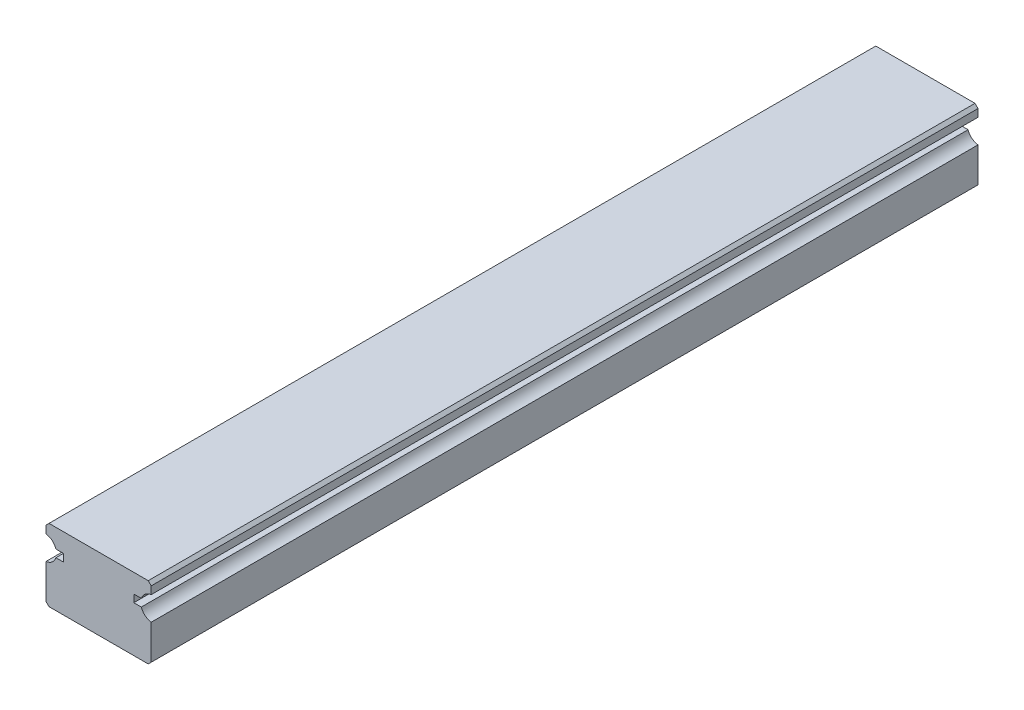
ISO-10303-21;
HEADER;
FILE_DESCRIPTION(('STEP AP214'),'2;1');
FILE_NAME('part.step','',(''),(''),'','','');
FILE_SCHEMA(('AUTOMOTIVE_DESIGN { 1 0 10303 214 1 1 1 1 }'));
ENDSEC;
DATA;
#1=APPLICATION_CONTEXT('core data for automotive mechanical design processes');
#2=APPLICATION_PROTOCOL_DEFINITION('international standard','automotive_design',2000,#1);
#3=PRODUCT_CONTEXT('',#1,'mechanical');
#4=PRODUCT('Part','Part','',(#3));
#5=PRODUCT_RELATED_PRODUCT_CATEGORY('part','',(#4));
#6=PRODUCT_DEFINITION_FORMATION('','',#4);
#7=PRODUCT_DEFINITION_CONTEXT('part definition',#1,'design');
#8=PRODUCT_DEFINITION('design','',#6,#7);
#9=PRODUCT_DEFINITION_SHAPE('','',#8);
#10=(LENGTH_UNIT() NAMED_UNIT(*) SI_UNIT(.MILLI.,.METRE.));
#11=(NAMED_UNIT(*) PLANE_ANGLE_UNIT() SI_UNIT($,.RADIAN.));
#12=(NAMED_UNIT(*) SI_UNIT($,.STERADIAN.) SOLID_ANGLE_UNIT());
#13=UNCERTAINTY_MEASURE_WITH_UNIT(LENGTH_MEASURE(1.E-05),#10,'distance_accuracy_value','');
#14=(GEOMETRIC_REPRESENTATION_CONTEXT(3) GLOBAL_UNCERTAINTY_ASSIGNED_CONTEXT((#13)) GLOBAL_UNIT_ASSIGNED_CONTEXT((#10,
#11,#12)) REPRESENTATION_CONTEXT('',''));
#15=CARTESIAN_POINT('',(0.,0.,0.));
#16=DIRECTION('',(0.,0.,1.));
#17=DIRECTION('',(1.,0.,0.));
#18=AXIS2_PLACEMENT_3D('',#15,#16,#17);
#19=CARTESIAN_POINT('',(-3.6,0.899999999999999,27.5));
#20=DIRECTION('',(0.,0.,-1.));
#21=DIRECTION('',(-1.,0.,0.));
#22=AXIS2_PLACEMENT_3D('',#19,#20,#21);
#23=CYLINDRICAL_SURFACE('',#22,0.800000000000001);
#24=CARTESIAN_POINT('',(-3.6,0.899999999999999,-27.5));
#25=DIRECTION('',(0.,0.,-1.));
#26=DIRECTION('',(-1.,0.,0.));
#27=AXIS2_PLACEMENT_3D('',#24,#25,#26);
#28=CIRCLE('',#27,0.800000000000001);
#29=CARTESIAN_POINT('',(-3.5,1.69372539331938,-27.5));
#30=VERTEX_POINT('',#29);
#31=CARTESIAN_POINT('',(-2.84006579232147,1.15,-27.5));
#32=VERTEX_POINT('',#31);
#33=EDGE_CURVE('E202',#30,#32,#28,.T.);
#34=ORIENTED_EDGE('',*,*,#33,.T.);
#35=DIRECTION('',(0.,0.,-1.));
#36=VECTOR('',#35,1.);
#37=CARTESIAN_POINT('',(-2.84006579232147,1.15,27.5));
#38=LINE('',#37,#36);
#39=CARTESIAN_POINT('',(-2.84006579232147,1.15,27.5));
#40=VERTEX_POINT('',#39);
#41=EDGE_CURVE('E11',#40,#32,#38,.T.);
#42=ORIENTED_EDGE('',*,*,#41,.F.);
#43=CARTESIAN_POINT('',(-3.6,0.899999999999999,27.5));
#44=DIRECTION('',(0.,0.,-1.));
#45=DIRECTION('',(-1.,0.,0.));
#46=AXIS2_PLACEMENT_3D('',#43,#44,#45);
#47=CIRCLE('',#46,0.800000000000001);
#48=CARTESIAN_POINT('',(-3.5,1.69372539331938,27.5));
#49=VERTEX_POINT('',#48);
#50=EDGE_CURVE('E240',#49,#40,#47,.T.);
#51=ORIENTED_EDGE('',*,*,#50,.F.);
#52=DIRECTION('',(0.,0.,-1.));
#53=VECTOR('',#52,1.);
#54=CARTESIAN_POINT('',(-3.5,1.69372539331938,27.5));
#55=LINE('',#54,#53);
#56=EDGE_CURVE('E198',#49,#30,#55,.T.);
#57=ORIENTED_EDGE('',*,*,#56,.T.);
#58=EDGE_LOOP('',(#34,#42,#51,#57));
#59=FACE_BOUND('',#58,.T.);
#60=ADVANCED_FACE('F34',(#59),#23,.F.);
#61=CARTESIAN_POINT('',(-2.84006579232147,1.15,27.5));
#62=DIRECTION('',(0.,1.,0.));
#63=DIRECTION('',(-1.,0.,0.));
#64=AXIS2_PLACEMENT_3D('',#61,#62,#63);
#65=PLANE('',#64);
#66=DIRECTION('',(1.,0.,0.));
#67=VECTOR('',#66,1.);
#68=CARTESIAN_POINT('',(-2.84006579232147,1.15,-27.5));
#69=LINE('',#68,#67);
#70=CARTESIAN_POINT('',(-2.34006579232147,1.15,-27.5));
#71=VERTEX_POINT('',#70);
#72=EDGE_CURVE('E205',#32,#71,#69,.T.);
#73=ORIENTED_EDGE('',*,*,#72,.T.);
#74=DIRECTION('',(0.,0.,-1.));
#75=VECTOR('',#74,1.);
#76=CARTESIAN_POINT('',(-2.34006579232147,1.15,27.5));
#77=LINE('',#76,#75);
#78=CARTESIAN_POINT('',(-2.34006579232147,1.15,27.5));
#79=VERTEX_POINT('',#78);
#80=EDGE_CURVE('E42',#79,#71,#77,.T.);
#81=ORIENTED_EDGE('',*,*,#80,.F.);
#82=DIRECTION('',(1.,0.,0.));
#83=VECTOR('',#82,1.);
#84=CARTESIAN_POINT('',(-2.84006579232147,1.15,27.5));
#85=LINE('',#84,#83);
#86=EDGE_CURVE('E129',#40,#79,#85,.T.);
#87=ORIENTED_EDGE('',*,*,#86,.F.);
#88=ORIENTED_EDGE('',*,*,#41,.T.);
#89=EDGE_LOOP('',(#73,#81,#87,#88));
#90=FACE_BOUND('',#89,.T.);
#91=ADVANCED_FACE('F358',(#90),#65,.F.);
#92=CARTESIAN_POINT('',(-2.34006579232147,0.649999999999998,27.5));
#93=DIRECTION('',(1.,0.,0.));
#94=DIRECTION('',(0.,0.,-1.));
#95=AXIS2_PLACEMENT_3D('',#92,#93,#94);
#96=PLANE('',#95);
#97=DIRECTION('',(0.,-1.,0.));
#98=VECTOR('',#97,1.);
#99=CARTESIAN_POINT('',(-2.34006579232147,0.649999999999998,-27.5));
#100=LINE('',#99,#98);
#101=CARTESIAN_POINT('',(-2.34006579232147,0.649999999999998,-27.5));
#102=VERTEX_POINT('',#101);
#103=EDGE_CURVE('E207',#71,#102,#100,.T.);
#104=ORIENTED_EDGE('',*,*,#103,.T.);
#105=DIRECTION('',(0.,0.,-1.));
#106=VECTOR('',#105,1.);
#107=CARTESIAN_POINT('',(-2.34006579232147,0.649999999999998,27.5));
#108=LINE('',#107,#106);
#109=CARTESIAN_POINT('',(-2.34006579232147,0.649999999999998,27.5));
#110=VERTEX_POINT('',#109);
#111=EDGE_CURVE('E283',#110,#102,#108,.T.);
#112=ORIENTED_EDGE('',*,*,#111,.F.);
#113=DIRECTION('',(0.,-1.,0.));
#114=VECTOR('',#113,1.);
#115=CARTESIAN_POINT('',(-2.34006579232147,0.649999999999998,27.5));
#116=LINE('',#115,#114);
#117=EDGE_CURVE('E291',#79,#110,#116,.T.);
#118=ORIENTED_EDGE('',*,*,#117,.F.);
#119=ORIENTED_EDGE('',*,*,#80,.T.);
#120=EDGE_LOOP('',(#104,#112,#118,#119));
#121=FACE_BOUND('',#120,.T.);
#122=ADVANCED_FACE('F289',(#121),#96,.F.);
#123=CARTESIAN_POINT('',(-2.84006579232147,0.649999999999999,27.5));
#124=DIRECTION('',(0.,-1.,0.));
#125=DIRECTION('',(1.,0.,0.));
#126=AXIS2_PLACEMENT_3D('',#123,#124,#125);
#127=PLANE('',#126);
#128=DIRECTION('',(-1.,0.,0.));
#129=VECTOR('',#128,1.);
#130=CARTESIAN_POINT('',(-2.84006579232147,0.649999999999999,-27.5));
#131=LINE('',#130,#129);
#132=CARTESIAN_POINT('',(-2.84006579232147,0.65,-27.5));
#133=VERTEX_POINT('',#132);
#134=EDGE_CURVE('E209',#102,#133,#131,.T.);
#135=ORIENTED_EDGE('',*,*,#134,.T.);
#136=DIRECTION('',(0.,0.,-1.));
#137=VECTOR('',#136,1.);
#138=CARTESIAN_POINT('',(-2.84006579232147,0.65,27.5));
#139=LINE('',#138,#137);
#140=CARTESIAN_POINT('',(-2.84006579232147,0.65,27.5));
#141=VERTEX_POINT('',#140);
#142=EDGE_CURVE('E280',#141,#133,#139,.T.);
#143=ORIENTED_EDGE('',*,*,#142,.F.);
#144=DIRECTION('',(-1.,0.,0.));
#145=VECTOR('',#144,1.);
#146=CARTESIAN_POINT('',(-2.84006579232147,0.649999999999999,27.5));
#147=LINE('',#146,#145);
#148=EDGE_CURVE('E309',#110,#141,#147,.T.);
#149=ORIENTED_EDGE('',*,*,#148,.F.);
#150=ORIENTED_EDGE('',*,*,#111,.T.);
#151=EDGE_LOOP('',(#135,#143,#149,#150));
#152=FACE_BOUND('',#151,.T.);
#153=ADVANCED_FACE('F300',(#152),#127,.F.);
#154=CARTESIAN_POINT('',(-3.6,0.899999999999999,27.5));
#155=DIRECTION('',(0.,0.,-1.));
#156=DIRECTION('',(-1.,0.,0.));
#157=AXIS2_PLACEMENT_3D('',#154,#155,#156);
#158=CYLINDRICAL_SURFACE('',#157,0.800000000000001);
#159=CARTESIAN_POINT('',(-3.6,0.899999999999999,-27.5));
#160=DIRECTION('',(0.,0.,-1.));
#161=DIRECTION('',(-1.,0.,0.));
#162=AXIS2_PLACEMENT_3D('',#159,#160,#161);
#163=CIRCLE('',#162,0.800000000000001);
#164=CARTESIAN_POINT('',(-3.5,0.106274606680622,-27.5));
#165=VERTEX_POINT('',#164);
#166=EDGE_CURVE('E211',#133,#165,#163,.T.);
#167=ORIENTED_EDGE('',*,*,#166,.T.);
#168=DIRECTION('',(0.,0.,-1.));
#169=VECTOR('',#168,1.);
#170=CARTESIAN_POINT('',(-3.5,0.106274606680622,27.5));
#171=LINE('',#170,#169);
#172=CARTESIAN_POINT('',(-3.5,0.106274606680622,27.5));
#173=VERTEX_POINT('',#172);
#174=EDGE_CURVE('E277',#173,#165,#171,.T.);
#175=ORIENTED_EDGE('',*,*,#174,.F.);
#176=CARTESIAN_POINT('',(-3.6,0.899999999999999,27.5));
#177=DIRECTION('',(0.,0.,-1.));
#178=DIRECTION('',(-1.,0.,0.));
#179=AXIS2_PLACEMENT_3D('',#176,#177,#178);
#180=CIRCLE('',#179,0.800000000000001);
#181=EDGE_CURVE('E306',#141,#173,#180,.T.);
#182=ORIENTED_EDGE('',*,*,#181,.F.);
#183=ORIENTED_EDGE('',*,*,#142,.T.);
#184=EDGE_LOOP('',(#167,#175,#182,#183));
#185=FACE_BOUND('',#184,.T.);
#186=ADVANCED_FACE('F304',(#185),#158,.F.);
#187=CARTESIAN_POINT('',(-3.5,-2.2,27.5));
#188=DIRECTION('',(1.,0.,0.));
#189=DIRECTION('',(0.,1.,0.));
#190=AXIS2_PLACEMENT_3D('',#187,#188,#189);
#191=PLANE('',#190);
#192=DIRECTION('',(0.,-1.,0.));
#193=VECTOR('',#192,1.);
#194=CARTESIAN_POINT('',(-3.5,-2.2,-27.5));
#195=LINE('',#194,#193);
#196=CARTESIAN_POINT('',(-3.5,-2.2,-27.5));
#197=VERTEX_POINT('',#196);
#198=EDGE_CURVE('E213',#165,#197,#195,.T.);
#199=ORIENTED_EDGE('',*,*,#198,.T.);
#200=DIRECTION('',(0.,0.,-1.));
#201=VECTOR('',#200,1.);
#202=CARTESIAN_POINT('',(-3.5,-2.2,27.5));
#203=LINE('',#202,#201);
#204=CARTESIAN_POINT('',(-3.5,-2.2,27.5));
#205=VERTEX_POINT('',#204);
#206=EDGE_CURVE('E274',#205,#197,#203,.T.);
#207=ORIENTED_EDGE('',*,*,#206,.F.);
#208=DIRECTION('',(0.,-1.,0.));
#209=VECTOR('',#208,1.);
#210=CARTESIAN_POINT('',(-3.5,-2.2,27.5));
#211=LINE('',#210,#209);
#212=EDGE_CURVE('E308',#173,#205,#211,.T.);
#213=ORIENTED_EDGE('',*,*,#212,.F.);
#214=ORIENTED_EDGE('',*,*,#174,.T.);
#215=EDGE_LOOP('',(#199,#207,#213,#214));
#216=FACE_BOUND('',#215,.T.);
#217=ADVANCED_FACE('F371',(#216),#191,.F.);
#218=CARTESIAN_POINT('',(-3.5,-2.2,27.5));
#219=DIRECTION('',(0.707106781186548,0.707106781186548,0.));
#220=DIRECTION('',(-0.707106781186548,0.707106781186548,0.));
#221=AXIS2_PLACEMENT_3D('',#218,#219,#220);
#222=PLANE('',#221);
#223=DIRECTION('',(0.707106781186548,-0.707106781186548,0.));
#224=VECTOR('',#223,1.);
#225=CARTESIAN_POINT('',(-3.5,-2.2,-27.5));
#226=LINE('',#225,#224);
#227=CARTESIAN_POINT('',(-3.3,-2.4,-27.5));
#228=VERTEX_POINT('',#227);
#229=EDGE_CURVE('E215',#197,#228,#226,.T.);
#230=ORIENTED_EDGE('',*,*,#229,.T.);
#231=DIRECTION('',(0.,0.,-1.));
#232=VECTOR('',#231,1.);
#233=CARTESIAN_POINT('',(-3.3,-2.4,27.5));
#234=LINE('',#233,#232);
#235=CARTESIAN_POINT('',(-3.3,-2.4,27.5));
#236=VERTEX_POINT('',#235);
#237=EDGE_CURVE('E271',#236,#228,#234,.T.);
#238=ORIENTED_EDGE('',*,*,#237,.F.);
#239=DIRECTION('',(0.707106781186548,-0.707106781186548,0.));
#240=VECTOR('',#239,1.);
#241=CARTESIAN_POINT('',(-3.5,-2.2,27.5));
#242=LINE('',#241,#240);
#243=EDGE_CURVE('E311',#205,#236,#242,.T.);
#244=ORIENTED_EDGE('',*,*,#243,.F.);
#245=ORIENTED_EDGE('',*,*,#206,.T.);
#246=EDGE_LOOP('',(#230,#238,#244,#245));
#247=FACE_BOUND('',#246,.T.);
#248=ADVANCED_FACE('F374',(#247),#222,.F.);
#249=CARTESIAN_POINT('',(-3.3,-2.4,27.5));
#250=DIRECTION('',(0.,1.,0.));
#251=DIRECTION('',(0.,0.,1.));
#252=AXIS2_PLACEMENT_3D('',#249,#250,#251);
#253=PLANE('',#252);
#254=DIRECTION('',(1.,0.,0.));
#255=VECTOR('',#254,1.);
#256=CARTESIAN_POINT('',(-3.3,-2.4,-27.5));
#257=LINE('',#256,#255);
#258=CARTESIAN_POINT('',(3.3,-2.4,-27.5));
#259=VERTEX_POINT('',#258);
#260=EDGE_CURVE('E217',#228,#259,#257,.T.);
#261=ORIENTED_EDGE('',*,*,#260,.T.);
#262=DIRECTION('',(0.,0.,-1.));
#263=VECTOR('',#262,1.);
#264=CARTESIAN_POINT('',(3.3,-2.4,27.5));
#265=LINE('',#264,#263);
#266=CARTESIAN_POINT('',(3.3,-2.4,27.5));
#267=VERTEX_POINT('',#266);
#268=EDGE_CURVE('E268',#267,#259,#265,.T.);
#269=ORIENTED_EDGE('',*,*,#268,.F.);
#270=DIRECTION('',(1.,0.,0.));
#271=VECTOR('',#270,1.);
#272=CARTESIAN_POINT('',(-3.3,-2.4,27.5));
#273=LINE('',#272,#271);
#274=EDGE_CURVE('E317',#236,#267,#273,.T.);
#275=ORIENTED_EDGE('',*,*,#274,.F.);
#276=ORIENTED_EDGE('',*,*,#237,.T.);
#277=EDGE_LOOP('',(#261,#269,#275,#276));
#278=FACE_BOUND('',#277,.T.);
#279=ADVANCED_FACE('F378',(#278),#253,.F.);
#280=CARTESIAN_POINT('',(3.3,-2.4,27.5));
#281=DIRECTION('',(-0.707106781186548,0.707106781186548,0.));
#282=DIRECTION('',(-0.707106781186548,-0.707106781186548,0.));
#283=AXIS2_PLACEMENT_3D('',#280,#281,#282);
#284=PLANE('',#283);
#285=DIRECTION('',(0.707106781186548,0.707106781186548,0.));
#286=VECTOR('',#285,1.);
#287=CARTESIAN_POINT('',(3.3,-2.4,-27.5));
#288=LINE('',#287,#286);
#289=CARTESIAN_POINT('',(3.5,-2.2,-27.5));
#290=VERTEX_POINT('',#289);
#291=EDGE_CURVE('E219',#259,#290,#288,.T.);
#292=ORIENTED_EDGE('',*,*,#291,.T.);
#293=DIRECTION('',(0.,0.,-1.));
#294=VECTOR('',#293,1.);
#295=CARTESIAN_POINT('',(3.5,-2.2,27.5));
#296=LINE('',#295,#294);
#297=CARTESIAN_POINT('',(3.5,-2.2,27.5));
#298=VERTEX_POINT('',#297);
#299=EDGE_CURVE('E265',#298,#290,#296,.T.);
#300=ORIENTED_EDGE('',*,*,#299,.F.);
#301=DIRECTION('',(0.707106781186548,0.707106781186548,0.));
#302=VECTOR('',#301,1.);
#303=CARTESIAN_POINT('',(3.3,-2.4,27.5));
#304=LINE('',#303,#302);
#305=EDGE_CURVE('E319',#267,#298,#304,.T.);
#306=ORIENTED_EDGE('',*,*,#305,.F.);
#307=ORIENTED_EDGE('',*,*,#268,.T.);
#308=EDGE_LOOP('',(#292,#300,#306,#307));
#309=FACE_BOUND('',#308,.T.);
#310=ADVANCED_FACE('F382',(#309),#284,.F.);
#311=CARTESIAN_POINT('',(3.5,-2.2,27.5));
#312=DIRECTION('',(-1.,0.,0.));
#313=DIRECTION('',(0.,-1.,0.));
#314=AXIS2_PLACEMENT_3D('',#311,#312,#313);
#315=PLANE('',#314);
#316=DIRECTION('',(0.,1.,0.));
#317=VECTOR('',#316,1.);
#318=CARTESIAN_POINT('',(3.5,-2.2,-27.5));
#319=LINE('',#318,#317);
#320=CARTESIAN_POINT('',(3.5,0.106274606680621,-27.5));
#321=VERTEX_POINT('',#320);
#322=EDGE_CURVE('E221',#290,#321,#319,.T.);
#323=ORIENTED_EDGE('',*,*,#322,.T.);
#324=DIRECTION('',(0.,0.,-1.));
#325=VECTOR('',#324,1.);
#326=CARTESIAN_POINT('',(3.5,0.106274606680621,27.5));
#327=LINE('',#326,#325);
#328=CARTESIAN_POINT('',(3.5,0.106274606680621,27.5));
#329=VERTEX_POINT('',#328);
#330=EDGE_CURVE('E262',#329,#321,#327,.T.);
#331=ORIENTED_EDGE('',*,*,#330,.F.);
#332=DIRECTION('',(0.,1.,0.));
#333=VECTOR('',#332,1.);
#334=CARTESIAN_POINT('',(3.5,-2.2,27.5));
#335=LINE('',#334,#333);
#336=EDGE_CURVE('E321',#298,#329,#335,.T.);
#337=ORIENTED_EDGE('',*,*,#336,.F.);
#338=ORIENTED_EDGE('',*,*,#299,.T.);
#339=EDGE_LOOP('',(#323,#331,#337,#338));
#340=FACE_BOUND('',#339,.T.);
#341=ADVANCED_FACE('F386',(#340),#315,.F.);
#342=CARTESIAN_POINT('',(3.6,0.899999999999999,27.5));
#343=DIRECTION('',(0.,0.,-1.));
#344=DIRECTION('',(-1.,0.,0.));
#345=AXIS2_PLACEMENT_3D('',#342,#343,#344);
#346=CYLINDRICAL_SURFACE('',#345,0.800000000000001);
#347=CARTESIAN_POINT('',(3.6,0.899999999999999,-27.5));
#348=DIRECTION('',(0.,0.,-1.));
#349=DIRECTION('',(1.,0.,0.));
#350=AXIS2_PLACEMENT_3D('',#347,#348,#349);
#351=CIRCLE('',#350,0.800000000000001);
#352=CARTESIAN_POINT('',(2.84006579232146,0.649999999999999,-27.5));
#353=VERTEX_POINT('',#352);
#354=EDGE_CURVE('E223',#321,#353,#351,.T.);
#355=ORIENTED_EDGE('',*,*,#354,.T.);
#356=DIRECTION('',(0.,0.,-1.));
#357=VECTOR('',#356,1.);
#358=CARTESIAN_POINT('',(2.84006579232146,0.649999999999999,27.5));
#359=LINE('',#358,#357);
#360=CARTESIAN_POINT('',(2.84006579232146,0.649999999999999,27.5));
#361=VERTEX_POINT('',#360);
#362=EDGE_CURVE('E259',#361,#353,#359,.T.);
#363=ORIENTED_EDGE('',*,*,#362,.F.);
#364=CARTESIAN_POINT('',(3.6,0.899999999999999,27.5));
#365=DIRECTION('',(0.,0.,-1.));
#366=DIRECTION('',(1.,0.,0.));
#367=AXIS2_PLACEMENT_3D('',#364,#365,#366);
#368=CIRCLE('',#367,0.800000000000001);
#369=EDGE_CURVE('E323',#329,#361,#368,.T.);
#370=ORIENTED_EDGE('',*,*,#369,.F.);
#371=ORIENTED_EDGE('',*,*,#330,.T.);
#372=EDGE_LOOP('',(#355,#363,#370,#371));
#373=FACE_BOUND('',#372,.T.);
#374=ADVANCED_FACE('F390',(#373),#346,.F.);
#375=CARTESIAN_POINT('',(2.84006579232146,0.649999999999999,27.5));
#376=DIRECTION('',(0.,-1.,0.));
#377=DIRECTION('',(1.,0.,0.));
#378=AXIS2_PLACEMENT_3D('',#375,#376,#377);
#379=PLANE('',#378);
#380=DIRECTION('',(-1.,0.,0.));
#381=VECTOR('',#380,1.);
#382=CARTESIAN_POINT('',(2.84006579232146,0.649999999999999,-27.5));
#383=LINE('',#382,#381);
#384=CARTESIAN_POINT('',(2.34006579232147,0.649999999999998,-27.5));
#385=VERTEX_POINT('',#384);
#386=EDGE_CURVE('E225',#353,#385,#383,.T.);
#387=ORIENTED_EDGE('',*,*,#386,.T.);
#388=DIRECTION('',(0.,0.,-1.));
#389=VECTOR('',#388,1.);
#390=CARTESIAN_POINT('',(2.34006579232147,0.649999999999998,27.5));
#391=LINE('',#390,#389);
#392=CARTESIAN_POINT('',(2.34006579232147,0.649999999999998,27.5));
#393=VERTEX_POINT('',#392);
#394=EDGE_CURVE('E256',#393,#385,#391,.T.);
#395=ORIENTED_EDGE('',*,*,#394,.F.);
#396=DIRECTION('',(-1.,0.,0.));
#397=VECTOR('',#396,1.);
#398=CARTESIAN_POINT('',(2.84006579232146,0.649999999999999,27.5));
#399=LINE('',#398,#397);
#400=EDGE_CURVE('E325',#361,#393,#399,.T.);
#401=ORIENTED_EDGE('',*,*,#400,.F.);
#402=ORIENTED_EDGE('',*,*,#362,.T.);
#403=EDGE_LOOP('',(#387,#395,#401,#402));
#404=FACE_BOUND('',#403,.T.);
#405=ADVANCED_FACE('F394',(#404),#379,.F.);
#406=CARTESIAN_POINT('',(2.34006579232147,0.649999999999998,27.5));
#407=DIRECTION('',(-1.,0.,0.));
#408=DIRECTION('',(0.,0.,1.));
#409=AXIS2_PLACEMENT_3D('',#406,#407,#408);
#410=PLANE('',#409);
#411=DIRECTION('',(0.,1.,0.));
#412=VECTOR('',#411,1.);
#413=CARTESIAN_POINT('',(2.34006579232147,0.649999999999998,-27.5));
#414=LINE('',#413,#412);
#415=CARTESIAN_POINT('',(2.34006579232147,1.15,-27.5));
#416=VERTEX_POINT('',#415);
#417=EDGE_CURVE('E227',#385,#416,#414,.T.);
#418=ORIENTED_EDGE('',*,*,#417,.T.);
#419=DIRECTION('',(0.,0.,-1.));
#420=VECTOR('',#419,1.);
#421=CARTESIAN_POINT('',(2.34006579232147,1.15,27.5));
#422=LINE('',#421,#420);
#423=CARTESIAN_POINT('',(2.34006579232147,1.15,27.5));
#424=VERTEX_POINT('',#423);
#425=EDGE_CURVE('E253',#424,#416,#422,.T.);
#426=ORIENTED_EDGE('',*,*,#425,.F.);
#427=DIRECTION('',(0.,1.,0.));
#428=VECTOR('',#427,1.);
#429=CARTESIAN_POINT('',(2.34006579232147,0.649999999999998,27.5));
#430=LINE('',#429,#428);
#431=EDGE_CURVE('E327',#393,#424,#430,.T.);
#432=ORIENTED_EDGE('',*,*,#431,.F.);
#433=ORIENTED_EDGE('',*,*,#394,.T.);
#434=EDGE_LOOP('',(#418,#426,#432,#433));
#435=FACE_BOUND('',#434,.T.);
#436=ADVANCED_FACE('F398',(#435),#410,.F.);
#437=CARTESIAN_POINT('',(2.84006579232146,1.15,27.5));
#438=DIRECTION('',(0.,1.,0.));
#439=DIRECTION('',(-1.,0.,0.));
#440=AXIS2_PLACEMENT_3D('',#437,#438,#439);
#441=PLANE('',#440);
#442=DIRECTION('',(1.,0.,0.));
#443=VECTOR('',#442,1.);
#444=CARTESIAN_POINT('',(2.84006579232146,1.15,-27.5));
#445=LINE('',#444,#443);
#446=CARTESIAN_POINT('',(2.84006579232147,1.15,-27.5));
#447=VERTEX_POINT('',#446);
#448=EDGE_CURVE('E229',#416,#447,#445,.T.);
#449=ORIENTED_EDGE('',*,*,#448,.T.);
#450=DIRECTION('',(0.,0.,-1.));
#451=VECTOR('',#450,1.);
#452=CARTESIAN_POINT('',(2.84006579232147,1.15,27.5));
#453=LINE('',#452,#451);
#454=CARTESIAN_POINT('',(2.84006579232147,1.15,27.5));
#455=VERTEX_POINT('',#454);
#456=EDGE_CURVE('E250',#455,#447,#453,.T.);
#457=ORIENTED_EDGE('',*,*,#456,.F.);
#458=DIRECTION('',(1.,0.,0.));
#459=VECTOR('',#458,1.);
#460=CARTESIAN_POINT('',(2.84006579232146,1.15,27.5));
#461=LINE('',#460,#459);
#462=EDGE_CURVE('E329',#424,#455,#461,.T.);
#463=ORIENTED_EDGE('',*,*,#462,.F.);
#464=ORIENTED_EDGE('',*,*,#425,.T.);
#465=EDGE_LOOP('',(#449,#457,#463,#464));
#466=FACE_BOUND('',#465,.T.);
#467=ADVANCED_FACE('F402',(#466),#441,.F.);
#468=CARTESIAN_POINT('',(3.6,0.899999999999999,27.5));
#469=DIRECTION('',(0.,0.,-1.));
#470=DIRECTION('',(-1.,0.,0.));
#471=AXIS2_PLACEMENT_3D('',#468,#469,#470);
#472=CYLINDRICAL_SURFACE('',#471,0.800000000000001);
#473=CARTESIAN_POINT('',(3.6,0.899999999999999,-27.5));
#474=DIRECTION('',(0.,0.,-1.));
#475=DIRECTION('',(1.,0.,0.));
#476=AXIS2_PLACEMENT_3D('',#473,#474,#475);
#477=CIRCLE('',#476,0.800000000000001);
#478=CARTESIAN_POINT('',(3.5,1.69372539331938,-27.5));
#479=VERTEX_POINT('',#478);
#480=EDGE_CURVE('E231',#447,#479,#477,.T.);
#481=ORIENTED_EDGE('',*,*,#480,.T.);
#482=DIRECTION('',(0.,0.,-1.));
#483=VECTOR('',#482,1.);
#484=CARTESIAN_POINT('',(3.5,1.69372539331938,27.5));
#485=LINE('',#484,#483);
#486=CARTESIAN_POINT('',(3.5,1.69372539331938,27.5));
#487=VERTEX_POINT('',#486);
#488=EDGE_CURVE('E247',#487,#479,#485,.T.);
#489=ORIENTED_EDGE('',*,*,#488,.F.);
#490=CARTESIAN_POINT('',(3.6,0.899999999999999,27.5));
#491=DIRECTION('',(0.,0.,-1.));
#492=DIRECTION('',(1.,0.,0.));
#493=AXIS2_PLACEMENT_3D('',#490,#491,#492);
#494=CIRCLE('',#493,0.800000000000001);
#495=EDGE_CURVE('E331',#455,#487,#494,.T.);
#496=ORIENTED_EDGE('',*,*,#495,.F.);
#497=ORIENTED_EDGE('',*,*,#456,.T.);
#498=EDGE_LOOP('',(#481,#489,#496,#497));
#499=FACE_BOUND('',#498,.T.);
#500=ADVANCED_FACE('F406',(#499),#472,.F.);
#501=CARTESIAN_POINT('',(3.5,1.69372539331938,27.5));
#502=DIRECTION('',(-1.,0.,0.));
#503=DIRECTION('',(0.,-1.,0.));
#504=AXIS2_PLACEMENT_3D('',#501,#502,#503);
#505=PLANE('',#504);
#506=DIRECTION('',(0.,1.,0.));
#507=VECTOR('',#506,1.);
#508=CARTESIAN_POINT('',(3.5,1.69372539331938,-27.5));
#509=LINE('',#508,#507);
#510=CARTESIAN_POINT('',(3.5,2.2,-27.5));
#511=VERTEX_POINT('',#510);
#512=EDGE_CURVE('E233',#479,#511,#509,.T.);
#513=ORIENTED_EDGE('',*,*,#512,.T.);
#514=DIRECTION('',(0.,0.,-1.));
#515=VECTOR('',#514,1.);
#516=CARTESIAN_POINT('',(3.5,2.2,27.5));
#517=LINE('',#516,#515);
#518=CARTESIAN_POINT('',(3.5,2.2,27.5));
#519=VERTEX_POINT('',#518);
#520=EDGE_CURVE('E244',#519,#511,#517,.T.);
#521=ORIENTED_EDGE('',*,*,#520,.F.);
#522=DIRECTION('',(0.,1.,0.));
#523=VECTOR('',#522,1.);
#524=CARTESIAN_POINT('',(3.5,1.69372539331938,27.5));
#525=LINE('',#524,#523);
#526=EDGE_CURVE('E333',#487,#519,#525,.T.);
#527=ORIENTED_EDGE('',*,*,#526,.F.);
#528=ORIENTED_EDGE('',*,*,#488,.T.);
#529=EDGE_LOOP('',(#513,#521,#527,#528));
#530=FACE_BOUND('',#529,.T.);
#531=ADVANCED_FACE('F339',(#530),#505,.F.);
#532=CARTESIAN_POINT('',(3.3,2.4,27.5));
#533=DIRECTION('',(-0.707106781186547,-0.707106781186548,0.));
#534=DIRECTION('',(0.707106781186548,-0.707106781186547,0.));
#535=AXIS2_PLACEMENT_3D('',#532,#533,#534);
#536=PLANE('',#535);
#537=DIRECTION('',(-0.707106781186548,0.707106781186547,0.));
#538=VECTOR('',#537,1.);
#539=CARTESIAN_POINT('',(3.3,2.4,-27.5));
#540=LINE('',#539,#538);
#541=CARTESIAN_POINT('',(3.3,2.4,-27.5));
#542=VERTEX_POINT('',#541);
#543=EDGE_CURVE('E235',#511,#542,#540,.T.);
#544=ORIENTED_EDGE('',*,*,#543,.T.);
#545=DIRECTION('',(0.,0.,-1.));
#546=VECTOR('',#545,1.);
#547=CARTESIAN_POINT('',(3.3,2.4,27.5));
#548=LINE('',#547,#546);
#549=CARTESIAN_POINT('',(3.3,2.4,27.5));
#550=VERTEX_POINT('',#549);
#551=EDGE_CURVE('E193',#550,#542,#548,.T.);
#552=ORIENTED_EDGE('',*,*,#551,.F.);
#553=DIRECTION('',(-0.707106781186548,0.707106781186547,0.));
#554=VECTOR('',#553,1.);
#555=CARTESIAN_POINT('',(3.3,2.4,27.5));
#556=LINE('',#555,#554);
#557=EDGE_CURVE('E184',#519,#550,#556,.T.);
#558=ORIENTED_EDGE('',*,*,#557,.F.);
#559=ORIENTED_EDGE('',*,*,#520,.T.);
#560=EDGE_LOOP('',(#544,#552,#558,#559));
#561=FACE_BOUND('',#560,.T.);
#562=ADVANCED_FACE('F343',(#561),#536,.F.);
#563=CARTESIAN_POINT('',(-3.3,2.4,27.5));
#564=DIRECTION('',(0.,-1.,0.));
#565=DIRECTION('',(0.,0.,-1.));
#566=AXIS2_PLACEMENT_3D('',#563,#564,#565);
#567=PLANE('',#566);
#568=DIRECTION('',(-1.,0.,0.));
#569=VECTOR('',#568,1.);
#570=CARTESIAN_POINT('',(-3.3,2.4,-27.5));
#571=LINE('',#570,#569);
#572=CARTESIAN_POINT('',(-3.3,2.4,-27.5));
#573=VERTEX_POINT('',#572);
#574=EDGE_CURVE('E192',#542,#573,#571,.T.);
#575=ORIENTED_EDGE('',*,*,#574,.T.);
#576=DIRECTION('',(0.,0.,-1.));
#577=VECTOR('',#576,1.);
#578=CARTESIAN_POINT('',(-3.3,2.4,27.5));
#579=LINE('',#578,#577);
#580=CARTESIAN_POINT('',(-3.3,2.4,27.5));
#581=VERTEX_POINT('',#580);
#582=EDGE_CURVE('E189',#581,#573,#579,.T.);
#583=ORIENTED_EDGE('',*,*,#582,.F.);
#584=DIRECTION('',(-1.,0.,0.));
#585=VECTOR('',#584,1.);
#586=CARTESIAN_POINT('',(-3.3,2.4,27.5));
#587=LINE('',#586,#585);
#588=EDGE_CURVE('E178',#550,#581,#587,.T.);
#589=ORIENTED_EDGE('',*,*,#588,.F.);
#590=ORIENTED_EDGE('',*,*,#551,.T.);
#591=EDGE_LOOP('',(#575,#583,#589,#590));
#592=FACE_BOUND('',#591,.T.);
#593=ADVANCED_FACE('F190',(#592),#567,.F.);
#594=CARTESIAN_POINT('',(-3.5,2.2,27.5));
#595=DIRECTION('',(0.707106781186548,-0.707106781186548,0.));
#596=DIRECTION('',(0.707106781186548,0.707106781186548,0.));
#597=AXIS2_PLACEMENT_3D('',#594,#595,#596);
#598=PLANE('',#597);
#599=DIRECTION('',(-0.707106781186548,-0.707106781186548,0.));
#600=VECTOR('',#599,1.);
#601=CARTESIAN_POINT('',(-3.5,2.2,-27.5));
#602=LINE('',#601,#600);
#603=CARTESIAN_POINT('',(-3.5,2.2,-27.5));
#604=VERTEX_POINT('',#603);
#605=EDGE_CURVE('E115',#573,#604,#602,.T.);
#606=ORIENTED_EDGE('',*,*,#605,.T.);
#607=DIRECTION('',(0.,0.,-1.));
#608=VECTOR('',#607,1.);
#609=CARTESIAN_POINT('',(-3.5,2.2,27.5));
#610=LINE('',#609,#608);
#611=CARTESIAN_POINT('',(-3.5,2.2,27.5));
#612=VERTEX_POINT('',#611);
#613=EDGE_CURVE('E194',#612,#604,#610,.T.);
#614=ORIENTED_EDGE('',*,*,#613,.F.);
#615=DIRECTION('',(-0.707106781186548,-0.707106781186548,0.));
#616=VECTOR('',#615,1.);
#617=CARTESIAN_POINT('',(-3.5,2.2,27.5));
#618=LINE('',#617,#616);
#619=EDGE_CURVE('E182',#581,#612,#618,.T.);
#620=ORIENTED_EDGE('',*,*,#619,.F.);
#621=ORIENTED_EDGE('',*,*,#582,.T.);
#622=EDGE_LOOP('',(#606,#614,#620,#621));
#623=FACE_BOUND('',#622,.T.);
#624=ADVANCED_FACE('F196',(#623),#598,.F.);
#625=CARTESIAN_POINT('',(-3.5,1.69372539331938,27.5));
#626=DIRECTION('',(1.,0.,0.));
#627=DIRECTION('',(0.,1.,0.));
#628=AXIS2_PLACEMENT_3D('',#625,#626,#627);
#629=PLANE('',#628);
#630=DIRECTION('',(0.,-1.,0.));
#631=VECTOR('',#630,1.);
#632=CARTESIAN_POINT('',(-3.5,1.69372539331938,-27.5));
#633=LINE('',#632,#631);
#634=EDGE_CURVE('E121',#604,#30,#633,.T.);
#635=ORIENTED_EDGE('',*,*,#634,.T.);
#636=ORIENTED_EDGE('',*,*,#56,.F.);
#637=DIRECTION('',(0.,-1.,0.));
#638=VECTOR('',#637,1.);
#639=CARTESIAN_POINT('',(-3.5,1.69372539331938,27.5));
#640=LINE('',#639,#638);
#641=EDGE_CURVE('E50',#612,#49,#640,.T.);
#642=ORIENTED_EDGE('',*,*,#641,.F.);
#643=ORIENTED_EDGE('',*,*,#613,.T.);
#644=EDGE_LOOP('',(#635,#636,#642,#643));
#645=FACE_BOUND('',#644,.T.);
#646=ADVANCED_FACE('F347',(#645),#629,.F.);
#647=CARTESIAN_POINT('',(-3.6,0.899999999999999,27.5));
#648=DIRECTION('',(0.,0.,-1.));
#649=DIRECTION('',(-1.,0.,0.));
#650=AXIS2_PLACEMENT_3D('',#647,#648,#649);
#651=PLANE('',#650);
#652=ORIENTED_EDGE('',*,*,#50,.T.);
#653=ORIENTED_EDGE('',*,*,#86,.T.);
#654=ORIENTED_EDGE('',*,*,#117,.T.);
#655=ORIENTED_EDGE('',*,*,#148,.T.);
#656=ORIENTED_EDGE('',*,*,#181,.T.);
#657=ORIENTED_EDGE('',*,*,#212,.T.);
#658=ORIENTED_EDGE('',*,*,#243,.T.);
#659=ORIENTED_EDGE('',*,*,#274,.T.);
#660=ORIENTED_EDGE('',*,*,#305,.T.);
#661=ORIENTED_EDGE('',*,*,#336,.T.);
#662=ORIENTED_EDGE('',*,*,#369,.T.);
#663=ORIENTED_EDGE('',*,*,#400,.T.);
#664=ORIENTED_EDGE('',*,*,#431,.T.);
#665=ORIENTED_EDGE('',*,*,#462,.T.);
#666=ORIENTED_EDGE('',*,*,#495,.T.);
#667=ORIENTED_EDGE('',*,*,#526,.T.);
#668=ORIENTED_EDGE('',*,*,#557,.T.);
#669=ORIENTED_EDGE('',*,*,#588,.T.);
#670=ORIENTED_EDGE('',*,*,#619,.T.);
#671=ORIENTED_EDGE('',*,*,#641,.T.);
#672=EDGE_LOOP('',(#652,#653,#654,#655,#656,#657,#658,#659,#660,#661,#662,#663,#664,#665,#666,
#667,#668,#669,#670,#671));
#673=FACE_BOUND('',#672,.T.);
#674=ADVANCED_FACE('F180',(#673),#651,.F.);
#675=CARTESIAN_POINT('',(-3.6,0.899999999999999,-27.5));
#676=DIRECTION('',(0.,0.,-1.));
#677=DIRECTION('',(-1.,0.,0.));
#678=AXIS2_PLACEMENT_3D('',#675,#676,#677);
#679=PLANE('',#678);
#680=ORIENTED_EDGE('',*,*,#33,.F.);
#681=ORIENTED_EDGE('',*,*,#634,.F.);
#682=ORIENTED_EDGE('',*,*,#605,.F.);
#683=ORIENTED_EDGE('',*,*,#574,.F.);
#684=ORIENTED_EDGE('',*,*,#543,.F.);
#685=ORIENTED_EDGE('',*,*,#512,.F.);
#686=ORIENTED_EDGE('',*,*,#480,.F.);
#687=ORIENTED_EDGE('',*,*,#448,.F.);
#688=ORIENTED_EDGE('',*,*,#417,.F.);
#689=ORIENTED_EDGE('',*,*,#386,.F.);
#690=ORIENTED_EDGE('',*,*,#354,.F.);
#691=ORIENTED_EDGE('',*,*,#322,.F.);
#692=ORIENTED_EDGE('',*,*,#291,.F.);
#693=ORIENTED_EDGE('',*,*,#260,.F.);
#694=ORIENTED_EDGE('',*,*,#229,.F.);
#695=ORIENTED_EDGE('',*,*,#198,.F.);
#696=ORIENTED_EDGE('',*,*,#166,.F.);
#697=ORIENTED_EDGE('',*,*,#134,.F.);
#698=ORIENTED_EDGE('',*,*,#103,.F.);
#699=ORIENTED_EDGE('',*,*,#72,.F.);
#700=EDGE_LOOP('',(#680,#681,#682,#683,#684,#685,#686,#687,#688,#689,#690,#691,#692,#693,#694,
#695,#696,#697,#698,#699));
#701=FACE_BOUND('',#700,.T.);
#702=ADVANCED_FACE('F295',(#701),#679,.T.);
#703=CLOSED_SHELL('',(#60,#91,#122,#153,#186,#217,#248,#279,#310,#341,#374,#405,#436,#467,#500,
#531,#562,#593,#624,#646,#674,#702));
#704=MANIFOLD_SOLID_BREP('B2',#703);
#705=ADVANCED_BREP_SHAPE_REPRESENTATION('',(#18,#704),#14);
#706=SHAPE_DEFINITION_REPRESENTATION(#9,#705);
ENDSEC;
END-ISO-10303-21;
